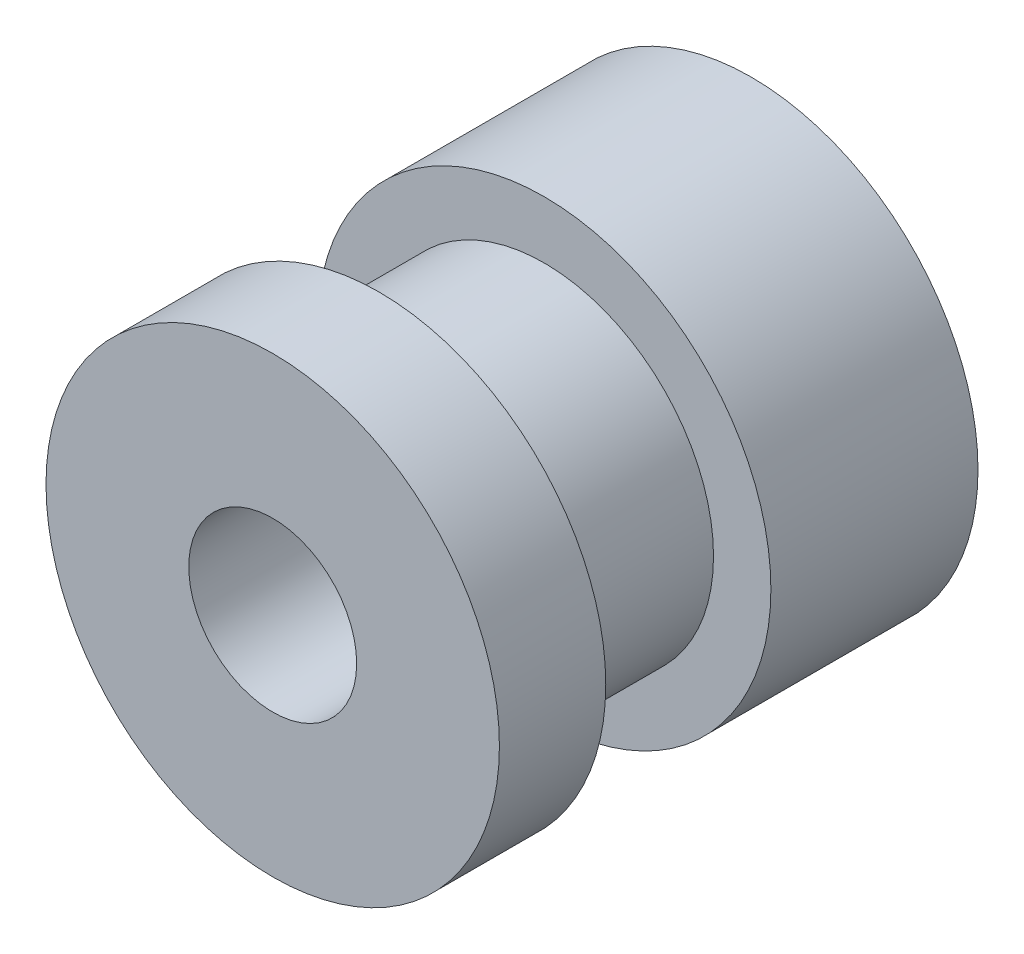
ISO-10303-21;
HEADER;
FILE_DESCRIPTION(('STEP AP214'),'2;1');
FILE_NAME('part.step','',(''),(''),'','','');
FILE_SCHEMA(('AUTOMOTIVE_DESIGN { 1 0 10303 214 1 1 1 1 }'));
ENDSEC;
DATA;
#1=APPLICATION_CONTEXT('core data for automotive mechanical design processes');
#2=APPLICATION_PROTOCOL_DEFINITION('international standard','automotive_design',2000,#1);
#3=PRODUCT_CONTEXT('',#1,'mechanical');
#4=PRODUCT('Part','Part','',(#3));
#5=PRODUCT_RELATED_PRODUCT_CATEGORY('part','',(#4));
#6=PRODUCT_DEFINITION_FORMATION('','',#4);
#7=PRODUCT_DEFINITION_CONTEXT('part definition',#1,'design');
#8=PRODUCT_DEFINITION('design','',#6,#7);
#9=PRODUCT_DEFINITION_SHAPE('','',#8);
#10=(LENGTH_UNIT() NAMED_UNIT(*) SI_UNIT(.MILLI.,.METRE.));
#11=(NAMED_UNIT(*) PLANE_ANGLE_UNIT() SI_UNIT($,.RADIAN.));
#12=(NAMED_UNIT(*) SI_UNIT($,.STERADIAN.) SOLID_ANGLE_UNIT());
#13=UNCERTAINTY_MEASURE_WITH_UNIT(LENGTH_MEASURE(1.E-05),#10,'distance_accuracy_value','');
#14=(GEOMETRIC_REPRESENTATION_CONTEXT(3) GLOBAL_UNCERTAINTY_ASSIGNED_CONTEXT((#13)) GLOBAL_UNIT_ASSIGNED_CONTEXT((#10,
#11,#12)) REPRESENTATION_CONTEXT('',''));
#15=CARTESIAN_POINT('',(0.,0.,0.));
#16=DIRECTION('',(0.,0.,1.));
#17=DIRECTION('',(1.,0.,0.));
#18=AXIS2_PLACEMENT_3D('',#15,#16,#17);
#19=CARTESIAN_POINT('',(0.,0.,0.));
#20=DIRECTION('',(0.,0.,1.));
#21=DIRECTION('',(1.,0.,0.));
#22=AXIS2_PLACEMENT_3D('',#19,#20,#21);
#23=CYLINDRICAL_SURFACE('',#22,6.05);
#24=CARTESIAN_POINT('',(0.,0.,-3.8));
#25=DIRECTION('',(0.,0.,1.));
#26=DIRECTION('',(1.,0.,0.));
#27=AXIS2_PLACEMENT_3D('',#24,#25,#26);
#28=CIRCLE('',#27,6.05);
#29=CARTESIAN_POINT('',(6.05,0.,-3.8));
#30=VERTEX_POINT('',#29);
#31=EDGE_CURVE('E10',#30,#30,#28,.T.);
#32=ORIENTED_EDGE('',*,*,#31,.F.);
#33=EDGE_LOOP('',(#32));
#34=FACE_BOUND('',#33,.T.);
#35=CARTESIAN_POINT('',(0.,0.,-9.7));
#36=DIRECTION('',(0.,0.,1.));
#37=DIRECTION('',(1.,0.,0.));
#38=AXIS2_PLACEMENT_3D('',#35,#36,#37);
#39=CIRCLE('',#38,6.05);
#40=CARTESIAN_POINT('',(6.05,0.,-9.7));
#41=VERTEX_POINT('',#40);
#42=EDGE_CURVE('E59',#41,#41,#39,.T.);
#43=ORIENTED_EDGE('',*,*,#42,.T.);
#44=EDGE_LOOP('',(#43));
#45=FACE_BOUND('',#44,.T.);
#46=ADVANCED_FACE('F31',(#34,#45),#23,.T.);
#47=CARTESIAN_POINT('',(-8.1,0.,-3.8));
#48=DIRECTION('',(0.,0.,1.));
#49=DIRECTION('',(1.,0.,0.));
#50=AXIS2_PLACEMENT_3D('',#47,#48,#49);
#51=PLANE('',#50);
#52=CARTESIAN_POINT('',(0.,0.,-3.8));
#53=DIRECTION('',(0.,0.,1.));
#54=DIRECTION('',(1.,0.,0.));
#55=AXIS2_PLACEMENT_3D('',#52,#53,#54);
#56=CIRCLE('',#55,8.1);
#57=CARTESIAN_POINT('',(8.1,0.,-3.8));
#58=VERTEX_POINT('',#57);
#59=EDGE_CURVE('E37',#58,#58,#56,.T.);
#60=ORIENTED_EDGE('',*,*,#59,.F.);
#61=EDGE_LOOP('',(#60));
#62=FACE_BOUND('',#61,.T.);
#63=ORIENTED_EDGE('',*,*,#31,.T.);
#64=EDGE_LOOP('',(#63));
#65=FACE_BOUND('',#64,.T.);
#66=ADVANCED_FACE('F96',(#62,#65),#51,.F.);
#67=CARTESIAN_POINT('',(0.,0.,0.));
#68=DIRECTION('',(0.,0.,1.));
#69=DIRECTION('',(1.,0.,0.));
#70=AXIS2_PLACEMENT_3D('',#67,#68,#69);
#71=CYLINDRICAL_SURFACE('',#70,8.1);
#72=CARTESIAN_POINT('',(0.,0.,0.));
#73=DIRECTION('',(0.,0.,1.));
#74=DIRECTION('',(1.,0.,0.));
#75=AXIS2_PLACEMENT_3D('',#72,#73,#74);
#76=CIRCLE('',#75,8.1);
#77=CARTESIAN_POINT('',(8.1,0.,0.));
#78=VERTEX_POINT('',#77);
#79=EDGE_CURVE('E41',#78,#78,#76,.T.);
#80=ORIENTED_EDGE('',*,*,#79,.F.);
#81=EDGE_LOOP('',(#80));
#82=FACE_BOUND('',#81,.T.);
#83=ORIENTED_EDGE('',*,*,#59,.T.);
#84=EDGE_LOOP('',(#83));
#85=FACE_BOUND('',#84,.T.);
#86=ADVANCED_FACE('F91',(#82,#85),#71,.T.);
#87=CARTESIAN_POINT('',(-3.,0.,0.));
#88=DIRECTION('',(0.,0.,-1.));
#89=DIRECTION('',(-1.,0.,0.));
#90=AXIS2_PLACEMENT_3D('',#87,#88,#89);
#91=PLANE('',#90);
#92=CARTESIAN_POINT('',(0.,0.,0.));
#93=DIRECTION('',(0.,0.,1.));
#94=DIRECTION('',(1.,0.,0.));
#95=AXIS2_PLACEMENT_3D('',#92,#93,#94);
#96=CIRCLE('',#95,3.);
#97=CARTESIAN_POINT('',(3.,0.,0.));
#98=VERTEX_POINT('',#97);
#99=EDGE_CURVE('E45',#98,#98,#96,.T.);
#100=ORIENTED_EDGE('',*,*,#99,.F.);
#101=EDGE_LOOP('',(#100));
#102=FACE_BOUND('',#101,.T.);
#103=ORIENTED_EDGE('',*,*,#79,.T.);
#104=EDGE_LOOP('',(#103));
#105=FACE_BOUND('',#104,.T.);
#106=ADVANCED_FACE('F85',(#102,#105),#91,.F.);
#107=CARTESIAN_POINT('',(0.,0.,0.));
#108=DIRECTION('',(0.,0.,1.));
#109=DIRECTION('',(1.,0.,0.));
#110=AXIS2_PLACEMENT_3D('',#107,#108,#109);
#111=CYLINDRICAL_SURFACE('',#110,3.);
#112=CARTESIAN_POINT('',(0.,0.,-17.1));
#113=DIRECTION('',(0.,0.,1.));
#114=DIRECTION('',(1.,0.,0.));
#115=AXIS2_PLACEMENT_3D('',#112,#113,#114);
#116=CIRCLE('',#115,3.);
#117=CARTESIAN_POINT('',(3.,0.,-17.1));
#118=VERTEX_POINT('',#117);
#119=EDGE_CURVE('E50',#118,#118,#116,.T.);
#120=ORIENTED_EDGE('',*,*,#119,.F.);
#121=EDGE_LOOP('',(#120));
#122=FACE_BOUND('',#121,.T.);
#123=ORIENTED_EDGE('',*,*,#99,.T.);
#124=EDGE_LOOP('',(#123));
#125=FACE_BOUND('',#124,.T.);
#126=ADVANCED_FACE('F79',(#122,#125),#111,.F.);
#127=CARTESIAN_POINT('',(-8.1,0.,-17.1));
#128=DIRECTION('',(0.,0.,1.));
#129=DIRECTION('',(1.,0.,0.));
#130=AXIS2_PLACEMENT_3D('',#127,#128,#129);
#131=PLANE('',#130);
#132=CARTESIAN_POINT('',(0.,0.,-17.1));
#133=DIRECTION('',(0.,0.,1.));
#134=DIRECTION('',(1.,0.,0.));
#135=AXIS2_PLACEMENT_3D('',#132,#133,#134);
#136=CIRCLE('',#135,8.1);
#137=CARTESIAN_POINT('',(8.1,0.,-17.1));
#138=VERTEX_POINT('',#137);
#139=EDGE_CURVE('E53',#138,#138,#136,.T.);
#140=ORIENTED_EDGE('',*,*,#139,.F.);
#141=EDGE_LOOP('',(#140));
#142=FACE_BOUND('',#141,.T.);
#143=ORIENTED_EDGE('',*,*,#119,.T.);
#144=EDGE_LOOP('',(#143));
#145=FACE_BOUND('',#144,.T.);
#146=ADVANCED_FACE('F73',(#142,#145),#131,.F.);
#147=CARTESIAN_POINT('',(0.,0.,0.));
#148=DIRECTION('',(0.,0.,1.));
#149=DIRECTION('',(1.,0.,0.));
#150=AXIS2_PLACEMENT_3D('',#147,#148,#149);
#151=CYLINDRICAL_SURFACE('',#150,8.1);
#152=CARTESIAN_POINT('',(0.,0.,-9.7));
#153=DIRECTION('',(0.,0.,1.));
#154=DIRECTION('',(1.,0.,0.));
#155=AXIS2_PLACEMENT_3D('',#152,#153,#154);
#156=CIRCLE('',#155,8.1);
#157=CARTESIAN_POINT('',(8.1,0.,-9.7));
#158=VERTEX_POINT('',#157);
#159=EDGE_CURVE('E56',#158,#158,#156,.T.);
#160=ORIENTED_EDGE('',*,*,#159,.F.);
#161=EDGE_LOOP('',(#160));
#162=FACE_BOUND('',#161,.T.);
#163=ORIENTED_EDGE('',*,*,#139,.T.);
#164=EDGE_LOOP('',(#163));
#165=FACE_BOUND('',#164,.T.);
#166=ADVANCED_FACE('F67',(#162,#165),#151,.T.);
#167=CARTESIAN_POINT('',(-6.05,0.,-9.7));
#168=DIRECTION('',(0.,0.,-1.));
#169=DIRECTION('',(-1.,0.,0.));
#170=AXIS2_PLACEMENT_3D('',#167,#168,#169);
#171=PLANE('',#170);
#172=ORIENTED_EDGE('',*,*,#42,.F.);
#173=EDGE_LOOP('',(#172));
#174=FACE_BOUND('',#173,.T.);
#175=ORIENTED_EDGE('',*,*,#159,.T.);
#176=EDGE_LOOP('',(#175));
#177=FACE_BOUND('',#176,.T.);
#178=ADVANCED_FACE('F64',(#174,#177),#171,.F.);
#179=CLOSED_SHELL('',(#46,#66,#86,#106,#126,#146,#166,#178));
#180=MANIFOLD_SOLID_BREP('B2',#179);
#181=ADVANCED_BREP_SHAPE_REPRESENTATION('',(#18,#180),#14);
#182=SHAPE_DEFINITION_REPRESENTATION(#9,#181);
ENDSEC;
END-ISO-10303-21;
